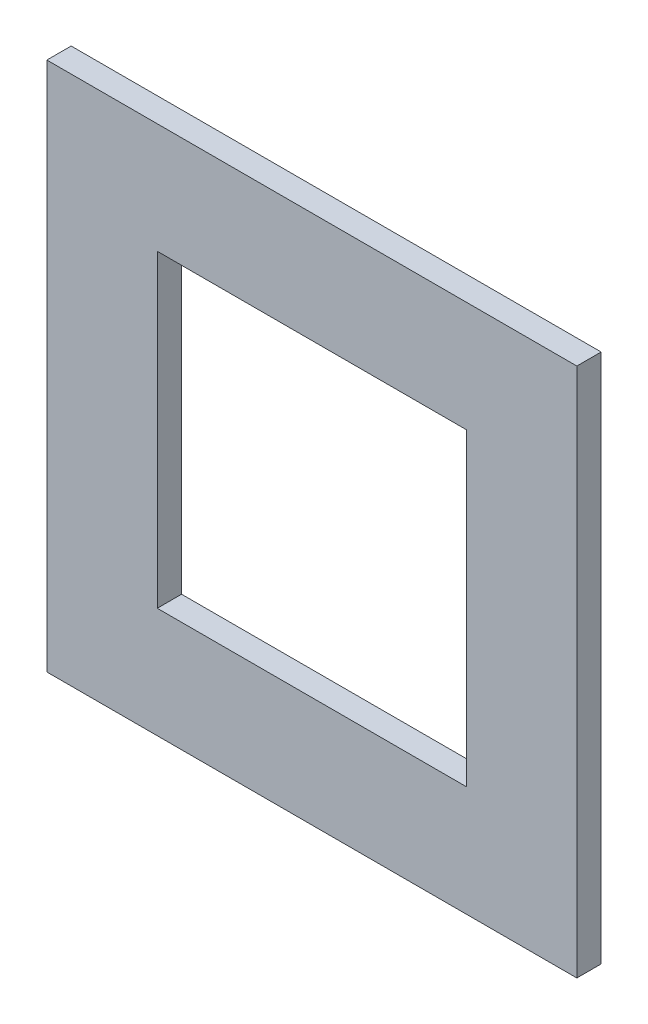
ISO-10303-21;
HEADER;
FILE_DESCRIPTION(('STEP AP214'),'2;1');
FILE_NAME('part.step','',(''),(''),'','','');
FILE_SCHEMA(('AUTOMOTIVE_DESIGN { 1 0 10303 214 1 1 1 1 }'));
ENDSEC;
DATA;
#1=APPLICATION_CONTEXT('core data for automotive mechanical design processes');
#2=APPLICATION_PROTOCOL_DEFINITION('international standard','automotive_design',2000,#1);
#3=PRODUCT_CONTEXT('',#1,'mechanical');
#4=PRODUCT('Part','Part','',(#3));
#5=PRODUCT_RELATED_PRODUCT_CATEGORY('part','',(#4));
#6=PRODUCT_DEFINITION_FORMATION('','',#4);
#7=PRODUCT_DEFINITION_CONTEXT('part definition',#1,'design');
#8=PRODUCT_DEFINITION('design','',#6,#7);
#9=PRODUCT_DEFINITION_SHAPE('','',#8);
#10=(LENGTH_UNIT() NAMED_UNIT(*) SI_UNIT(.MILLI.,.METRE.));
#11=(NAMED_UNIT(*) PLANE_ANGLE_UNIT() SI_UNIT($,.RADIAN.));
#12=(NAMED_UNIT(*) SI_UNIT($,.STERADIAN.) SOLID_ANGLE_UNIT());
#13=UNCERTAINTY_MEASURE_WITH_UNIT(LENGTH_MEASURE(1.E-05),#10,'distance_accuracy_value','');
#14=(GEOMETRIC_REPRESENTATION_CONTEXT(3) GLOBAL_UNCERTAINTY_ASSIGNED_CONTEXT((#13)) GLOBAL_UNIT_ASSIGNED_CONTEXT((#10,
#11,#12)) REPRESENTATION_CONTEXT('',''));
#15=CARTESIAN_POINT('',(0.,0.,0.));
#16=DIRECTION('',(0.,0.,1.));
#17=DIRECTION('',(1.,0.,0.));
#18=AXIS2_PLACEMENT_3D('',#15,#16,#17);
#19=CARTESIAN_POINT('',(0.,0.,1.1));
#20=DIRECTION('',(0.,0.,1.));
#21=DIRECTION('',(1.,0.,0.));
#22=AXIS2_PLACEMENT_3D('',#19,#20,#21);
#23=PLANE('',#22);
#24=DIRECTION('',(0.,1.,0.));
#25=VECTOR('',#24,1.);
#26=CARTESIAN_POINT('',(12.,12.,1.1));
#27=LINE('',#26,#25);
#28=CARTESIAN_POINT('',(12.,-12.,1.1));
#29=VERTEX_POINT('',#28);
#30=CARTESIAN_POINT('',(12.,12.,1.1));
#31=VERTEX_POINT('',#30);
#32=EDGE_CURVE('E153',#29,#31,#27,.T.);
#33=ORIENTED_EDGE('',*,*,#32,.T.);
#34=DIRECTION('',(-1.,0.,0.));
#35=VECTOR('',#34,1.);
#36=CARTESIAN_POINT('',(-12.,12.,1.1));
#37=LINE('',#36,#35);
#38=CARTESIAN_POINT('',(-12.,12.,1.1));
#39=VERTEX_POINT('',#38);
#40=EDGE_CURVE('E157',#31,#39,#37,.T.);
#41=ORIENTED_EDGE('',*,*,#40,.T.);
#42=DIRECTION('',(0.,-1.,0.));
#43=VECTOR('',#42,1.);
#44=CARTESIAN_POINT('',(-12.,12.,1.1));
#45=LINE('',#44,#43);
#46=CARTESIAN_POINT('',(-12.,-12.,1.1));
#47=VERTEX_POINT('',#46);
#48=EDGE_CURVE('E161',#39,#47,#45,.T.);
#49=ORIENTED_EDGE('',*,*,#48,.T.);
#50=DIRECTION('',(1.,0.,0.));
#51=VECTOR('',#50,1.);
#52=CARTESIAN_POINT('',(-12.,-12.,1.1));
#53=LINE('',#52,#51);
#54=EDGE_CURVE('E164',#47,#29,#53,.T.);
#55=ORIENTED_EDGE('',*,*,#54,.T.);
#56=EDGE_LOOP('',(#33,#41,#49,#55));
#57=FACE_BOUND('',#56,.T.);
#58=DIRECTION('',(-1.,0.,0.));
#59=VECTOR('',#58,1.);
#60=CARTESIAN_POINT('',(-7.,7.,1.1));
#61=LINE('',#60,#59);
#62=CARTESIAN_POINT('',(7.,7.,1.1));
#63=VERTEX_POINT('',#62);
#64=CARTESIAN_POINT('',(-7.,7.,1.1));
#65=VERTEX_POINT('',#64);
#66=EDGE_CURVE('E114',#63,#65,#61,.T.);
#67=ORIENTED_EDGE('',*,*,#66,.F.);
#68=DIRECTION('',(0.,1.,0.));
#69=VECTOR('',#68,1.);
#70=CARTESIAN_POINT('',(7.,7.,1.1));
#71=LINE('',#70,#69);
#72=CARTESIAN_POINT('',(7.,-7.,1.1));
#73=VERTEX_POINT('',#72);
#74=EDGE_CURVE('E105',#73,#63,#71,.T.);
#75=ORIENTED_EDGE('',*,*,#74,.F.);
#76=DIRECTION('',(1.,0.,0.));
#77=VECTOR('',#76,1.);
#78=CARTESIAN_POINT('',(-7.,-7.,1.1));
#79=LINE('',#78,#77);
#80=CARTESIAN_POINT('',(-7.,-7.,1.1));
#81=VERTEX_POINT('',#80);
#82=EDGE_CURVE('E131',#81,#73,#79,.T.);
#83=ORIENTED_EDGE('',*,*,#82,.F.);
#84=DIRECTION('',(0.,-1.,0.));
#85=VECTOR('',#84,1.);
#86=CARTESIAN_POINT('',(-7.,7.,1.1));
#87=LINE('',#86,#85);
#88=EDGE_CURVE('E127',#65,#81,#87,.T.);
#89=ORIENTED_EDGE('',*,*,#88,.F.);
#90=EDGE_LOOP('',(#67,#75,#83,#89));
#91=FACE_BOUND('',#90,.T.);
#92=ADVANCED_FACE('F39',(#57,#91),#23,.T.);
#93=CARTESIAN_POINT('',(0.,0.,0.));
#94=DIRECTION('',(0.,0.,1.));
#95=DIRECTION('',(1.,0.,0.));
#96=AXIS2_PLACEMENT_3D('',#93,#94,#95);
#97=PLANE('',#96);
#98=DIRECTION('',(0.,1.,0.));
#99=VECTOR('',#98,1.);
#100=CARTESIAN_POINT('',(12.,12.,0.));
#101=LINE('',#100,#99);
#102=CARTESIAN_POINT('',(12.,-12.,0.));
#103=VERTEX_POINT('',#102);
#104=CARTESIAN_POINT('',(12.,12.,0.));
#105=VERTEX_POINT('',#104);
#106=EDGE_CURVE('E123',#103,#105,#101,.T.);
#107=ORIENTED_EDGE('',*,*,#106,.F.);
#108=DIRECTION('',(1.,0.,0.));
#109=VECTOR('',#108,1.);
#110=CARTESIAN_POINT('',(-12.,-12.,0.));
#111=LINE('',#110,#109);
#112=CARTESIAN_POINT('',(-12.,-12.,0.));
#113=VERTEX_POINT('',#112);
#114=EDGE_CURVE('E158',#113,#103,#111,.T.);
#115=ORIENTED_EDGE('',*,*,#114,.F.);
#116=DIRECTION('',(0.,-1.,0.));
#117=VECTOR('',#116,1.);
#118=CARTESIAN_POINT('',(-12.,12.,0.));
#119=LINE('',#118,#117);
#120=CARTESIAN_POINT('',(-12.,12.,0.));
#121=VERTEX_POINT('',#120);
#122=EDGE_CURVE('E174',#121,#113,#119,.T.);
#123=ORIENTED_EDGE('',*,*,#122,.F.);
#124=DIRECTION('',(-1.,0.,0.));
#125=VECTOR('',#124,1.);
#126=CARTESIAN_POINT('',(-12.,12.,0.));
#127=LINE('',#126,#125);
#128=EDGE_CURVE('E171',#105,#121,#127,.T.);
#129=ORIENTED_EDGE('',*,*,#128,.F.);
#130=EDGE_LOOP('',(#107,#115,#123,#129));
#131=FACE_BOUND('',#130,.T.);
#132=DIRECTION('',(0.,1.,0.));
#133=VECTOR('',#132,1.);
#134=CARTESIAN_POINT('',(7.,7.,0.));
#135=LINE('',#134,#133);
#136=CARTESIAN_POINT('',(7.,-7.,0.));
#137=VERTEX_POINT('',#136);
#138=CARTESIAN_POINT('',(7.,7.,0.));
#139=VERTEX_POINT('',#138);
#140=EDGE_CURVE('E63',#137,#139,#135,.T.);
#141=ORIENTED_EDGE('',*,*,#140,.T.);
#142=DIRECTION('',(-1.,0.,0.));
#143=VECTOR('',#142,1.);
#144=CARTESIAN_POINT('',(-7.,7.,0.));
#145=LINE('',#144,#143);
#146=CARTESIAN_POINT('',(-7.,7.,0.));
#147=VERTEX_POINT('',#146);
#148=EDGE_CURVE('E121',#139,#147,#145,.T.);
#149=ORIENTED_EDGE('',*,*,#148,.T.);
#150=DIRECTION('',(0.,-1.,0.));
#151=VECTOR('',#150,1.);
#152=CARTESIAN_POINT('',(-7.,7.,0.));
#153=LINE('',#152,#151);
#154=CARTESIAN_POINT('',(-7.,-7.,0.));
#155=VERTEX_POINT('',#154);
#156=EDGE_CURVE('E140',#147,#155,#153,.T.);
#157=ORIENTED_EDGE('',*,*,#156,.T.);
#158=DIRECTION('',(1.,0.,0.));
#159=VECTOR('',#158,1.);
#160=CARTESIAN_POINT('',(-7.,-7.,0.));
#161=LINE('',#160,#159);
#162=EDGE_CURVE('E115',#155,#137,#161,.T.);
#163=ORIENTED_EDGE('',*,*,#162,.T.);
#164=EDGE_LOOP('',(#141,#149,#157,#163));
#165=FACE_BOUND('',#164,.T.);
#166=ADVANCED_FACE('F197',(#131,#165),#97,.F.);
#167=CARTESIAN_POINT('',(12.,12.,1.1));
#168=DIRECTION('',(-1.,0.,0.));
#169=DIRECTION('',(0.,0.,1.));
#170=AXIS2_PLACEMENT_3D('',#167,#168,#169);
#171=PLANE('',#170);
#172=ORIENTED_EDGE('',*,*,#106,.T.);
#173=DIRECTION('',(0.,0.,-1.));
#174=VECTOR('',#173,1.);
#175=CARTESIAN_POINT('',(12.,12.,1.1));
#176=LINE('',#175,#174);
#177=EDGE_CURVE('E11',#31,#105,#176,.T.);
#178=ORIENTED_EDGE('',*,*,#177,.F.);
#179=ORIENTED_EDGE('',*,*,#32,.F.);
#180=DIRECTION('',(0.,0.,-1.));
#181=VECTOR('',#180,1.);
#182=CARTESIAN_POINT('',(12.,-12.,1.1));
#183=LINE('',#182,#181);
#184=EDGE_CURVE('E167',#29,#103,#183,.T.);
#185=ORIENTED_EDGE('',*,*,#184,.T.);
#186=EDGE_LOOP('',(#172,#178,#179,#185));
#187=FACE_BOUND('',#186,.T.);
#188=ADVANCED_FACE('F41',(#187),#171,.F.);
#189=CARTESIAN_POINT('',(-12.,12.,1.1));
#190=DIRECTION('',(0.,-1.,0.));
#191=DIRECTION('',(0.,0.,-1.));
#192=AXIS2_PLACEMENT_3D('',#189,#190,#191);
#193=PLANE('',#192);
#194=ORIENTED_EDGE('',*,*,#128,.T.);
#195=DIRECTION('',(0.,0.,-1.));
#196=VECTOR('',#195,1.);
#197=CARTESIAN_POINT('',(-12.,12.,1.1));
#198=LINE('',#197,#196);
#199=EDGE_CURVE('E48',#39,#121,#198,.T.);
#200=ORIENTED_EDGE('',*,*,#199,.F.);
#201=ORIENTED_EDGE('',*,*,#40,.F.);
#202=ORIENTED_EDGE('',*,*,#177,.T.);
#203=EDGE_LOOP('',(#194,#200,#201,#202));
#204=FACE_BOUND('',#203,.T.);
#205=ADVANCED_FACE('F207',(#204),#193,.F.);
#206=CARTESIAN_POINT('',(-12.,12.,1.1));
#207=DIRECTION('',(1.,0.,0.));
#208=DIRECTION('',(0.,0.,-1.));
#209=AXIS2_PLACEMENT_3D('',#206,#207,#208);
#210=PLANE('',#209);
#211=ORIENTED_EDGE('',*,*,#122,.T.);
#212=DIRECTION('',(0.,0.,-1.));
#213=VECTOR('',#212,1.);
#214=CARTESIAN_POINT('',(-12.,-12.,1.1));
#215=LINE('',#214,#213);
#216=EDGE_CURVE('E182',#47,#113,#215,.T.);
#217=ORIENTED_EDGE('',*,*,#216,.F.);
#218=ORIENTED_EDGE('',*,*,#48,.F.);
#219=ORIENTED_EDGE('',*,*,#199,.T.);
#220=EDGE_LOOP('',(#211,#217,#218,#219));
#221=FACE_BOUND('',#220,.T.);
#222=ADVANCED_FACE('F191',(#221),#210,.F.);
#223=CARTESIAN_POINT('',(-12.,-12.,1.1));
#224=DIRECTION('',(0.,1.,0.));
#225=DIRECTION('',(0.,0.,1.));
#226=AXIS2_PLACEMENT_3D('',#223,#224,#225);
#227=PLANE('',#226);
#228=ORIENTED_EDGE('',*,*,#114,.T.);
#229=ORIENTED_EDGE('',*,*,#184,.F.);
#230=ORIENTED_EDGE('',*,*,#54,.F.);
#231=ORIENTED_EDGE('',*,*,#216,.T.);
#232=EDGE_LOOP('',(#228,#229,#230,#231));
#233=FACE_BOUND('',#232,.T.);
#234=ADVANCED_FACE('F201',(#233),#227,.F.);
#235=CARTESIAN_POINT('',(7.,7.,1.1));
#236=DIRECTION('',(-1.,0.,0.));
#237=DIRECTION('',(0.,0.,1.));
#238=AXIS2_PLACEMENT_3D('',#235,#236,#237);
#239=PLANE('',#238);
#240=ORIENTED_EDGE('',*,*,#140,.F.);
#241=DIRECTION('',(0.,0.,-1.));
#242=VECTOR('',#241,1.);
#243=CARTESIAN_POINT('',(7.,-7.,1.1));
#244=LINE('',#243,#242);
#245=EDGE_CURVE('E109',#73,#137,#244,.T.);
#246=ORIENTED_EDGE('',*,*,#245,.F.);
#247=ORIENTED_EDGE('',*,*,#74,.T.);
#248=DIRECTION('',(0.,0.,-1.));
#249=VECTOR('',#248,1.);
#250=CARTESIAN_POINT('',(7.,7.,1.1));
#251=LINE('',#250,#249);
#252=EDGE_CURVE('E108',#63,#139,#251,.T.);
#253=ORIENTED_EDGE('',*,*,#252,.T.);
#254=EDGE_LOOP('',(#240,#246,#247,#253));
#255=FACE_BOUND('',#254,.T.);
#256=ADVANCED_FACE('F107',(#255),#239,.T.);
#257=CARTESIAN_POINT('',(-7.,7.,1.1));
#258=DIRECTION('',(0.,-1.,0.));
#259=DIRECTION('',(0.,0.,-1.));
#260=AXIS2_PLACEMENT_3D('',#257,#258,#259);
#261=PLANE('',#260);
#262=ORIENTED_EDGE('',*,*,#148,.F.);
#263=ORIENTED_EDGE('',*,*,#252,.F.);
#264=ORIENTED_EDGE('',*,*,#66,.T.);
#265=DIRECTION('',(0.,0.,-1.));
#266=VECTOR('',#265,1.);
#267=CARTESIAN_POINT('',(-7.,7.,1.1));
#268=LINE('',#267,#266);
#269=EDGE_CURVE('E124',#65,#147,#268,.T.);
#270=ORIENTED_EDGE('',*,*,#269,.T.);
#271=EDGE_LOOP('',(#262,#263,#264,#270));
#272=FACE_BOUND('',#271,.T.);
#273=ADVANCED_FACE('F118',(#272),#261,.T.);
#274=CARTESIAN_POINT('',(-7.,7.,1.1));
#275=DIRECTION('',(1.,0.,0.));
#276=DIRECTION('',(0.,0.,-1.));
#277=AXIS2_PLACEMENT_3D('',#274,#275,#276);
#278=PLANE('',#277);
#279=ORIENTED_EDGE('',*,*,#156,.F.);
#280=ORIENTED_EDGE('',*,*,#269,.F.);
#281=ORIENTED_EDGE('',*,*,#88,.T.);
#282=DIRECTION('',(0.,0.,-1.));
#283=VECTOR('',#282,1.);
#284=CARTESIAN_POINT('',(-7.,-7.,1.1));
#285=LINE('',#284,#283);
#286=EDGE_CURVE('E55',#81,#155,#285,.T.);
#287=ORIENTED_EDGE('',*,*,#286,.T.);
#288=EDGE_LOOP('',(#279,#280,#281,#287));
#289=FACE_BOUND('',#288,.T.);
#290=ADVANCED_FACE('F230',(#289),#278,.T.);
#291=CARTESIAN_POINT('',(-7.,-7.,1.1));
#292=DIRECTION('',(0.,1.,0.));
#293=DIRECTION('',(0.,0.,1.));
#294=AXIS2_PLACEMENT_3D('',#291,#292,#293);
#295=PLANE('',#294);
#296=ORIENTED_EDGE('',*,*,#162,.F.);
#297=ORIENTED_EDGE('',*,*,#286,.F.);
#298=ORIENTED_EDGE('',*,*,#82,.T.);
#299=ORIENTED_EDGE('',*,*,#245,.T.);
#300=EDGE_LOOP('',(#296,#297,#298,#299));
#301=FACE_BOUND('',#300,.T.);
#302=ADVANCED_FACE('F234',(#301),#295,.T.);
#303=CLOSED_SHELL('',(#92,#166,#188,#205,#222,#234,#256,#273,#290,#302));
#304=MANIFOLD_SOLID_BREP('B2',#303);
#305=ADVANCED_BREP_SHAPE_REPRESENTATION('',(#18,#304),#14);
#306=SHAPE_DEFINITION_REPRESENTATION(#9,#305);
ENDSEC;
END-ISO-10303-21;
